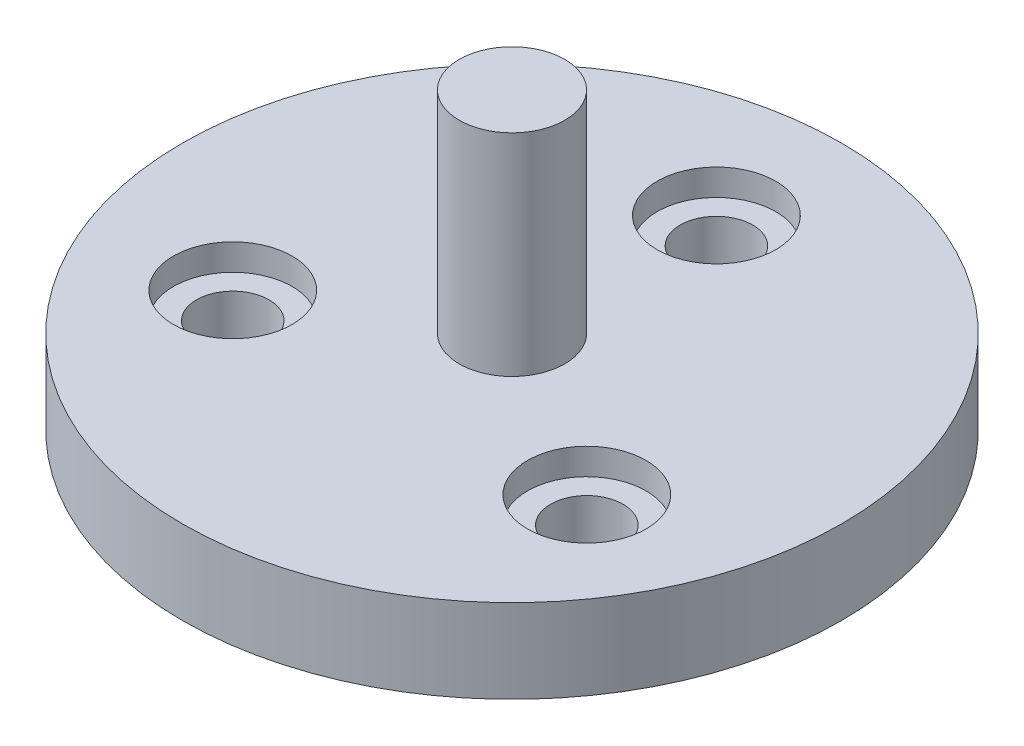
ISO-10303-21;
HEADER;
FILE_DESCRIPTION(('STEP AP214'),'2;1');
FILE_NAME('part.step','',(''),(''),'','','');
FILE_SCHEMA(('AUTOMOTIVE_DESIGN { 1 0 10303 214 1 1 1 1 }'));
ENDSEC;
DATA;
#1=APPLICATION_CONTEXT('core data for automotive mechanical design processes');
#2=APPLICATION_PROTOCOL_DEFINITION('international standard','automotive_design',2000,#1);
#3=PRODUCT_CONTEXT('',#1,'mechanical');
#4=PRODUCT('Part','Part','',(#3));
#5=PRODUCT_RELATED_PRODUCT_CATEGORY('part','',(#4));
#6=PRODUCT_DEFINITION_FORMATION('','',#4);
#7=PRODUCT_DEFINITION_CONTEXT('part definition',#1,'design');
#8=PRODUCT_DEFINITION('design','',#6,#7);
#9=PRODUCT_DEFINITION_SHAPE('','',#8);
#10=(LENGTH_UNIT() NAMED_UNIT(*) SI_UNIT(.MILLI.,.METRE.));
#11=(NAMED_UNIT(*) PLANE_ANGLE_UNIT() SI_UNIT($,.RADIAN.));
#12=(NAMED_UNIT(*) SI_UNIT($,.STERADIAN.) SOLID_ANGLE_UNIT());
#13=UNCERTAINTY_MEASURE_WITH_UNIT(LENGTH_MEASURE(1.E-05),#10,'distance_accuracy_value','');
#14=(GEOMETRIC_REPRESENTATION_CONTEXT(3) GLOBAL_UNCERTAINTY_ASSIGNED_CONTEXT((#13)) GLOBAL_UNIT_ASSIGNED_CONTEXT((#10,
#11,#12)) REPRESENTATION_CONTEXT('',''));
#15=CARTESIAN_POINT('',(0.,0.,0.));
#16=DIRECTION('',(0.,0.,1.));
#17=DIRECTION('',(1.,0.,0.));
#18=AXIS2_PLACEMENT_3D('',#15,#16,#17);
#19=CARTESIAN_POINT('',(0.,0.,4.));
#20=DIRECTION('',(0.,-1.,0.));
#21=DIRECTION('',(0.,0.,-1.));
#22=AXIS2_PLACEMENT_3D('',#19,#20,#21);
#23=PLANE('',#22);
#24=CARTESIAN_POINT('',(-13.4233937586588,0.,7.74999999999996));
#25=DIRECTION('',(0.,1.,0.));
#26=DIRECTION('',(0.,0.,1.));
#27=AXIS2_PLACEMENT_3D('',#24,#25,#26);
#28=CIRCLE('',#27,4.5);
#29=CARTESIAN_POINT('',(-13.4233937586588,0.,12.25));
#30=VERTEX_POINT('',#29);
#31=EDGE_CURVE('E72',#30,#30,#28,.T.);
#32=ORIENTED_EDGE('',*,*,#31,.F.);
#33=EDGE_LOOP('',(#32));
#34=FACE_BOUND('',#33,.T.);
#35=CARTESIAN_POINT('',(13.4233937586588,0.,7.75000000000007));
#36=DIRECTION('',(0.,1.,0.));
#37=DIRECTION('',(0.,0.,1.));
#38=AXIS2_PLACEMENT_3D('',#35,#36,#37);
#39=CIRCLE('',#38,4.5);
#40=CARTESIAN_POINT('',(13.4233937586588,0.,12.2500000000001));
#41=VERTEX_POINT('',#40);
#42=EDGE_CURVE('E60',#41,#41,#39,.T.);
#43=ORIENTED_EDGE('',*,*,#42,.F.);
#44=EDGE_LOOP('',(#43));
#45=FACE_BOUND('',#44,.T.);
#46=CARTESIAN_POINT('',(0.,0.,0.));
#47=DIRECTION('',(0.,-1.,0.));
#48=DIRECTION('',(0.,0.,-1.));
#49=AXIS2_PLACEMENT_3D('',#46,#47,#48);
#50=CIRCLE('',#49,25.);
#51=CARTESIAN_POINT('',(0.,0.,-25.));
#52=VERTEX_POINT('',#51);
#53=EDGE_CURVE('E42',#52,#52,#50,.T.);
#54=ORIENTED_EDGE('',*,*,#53,.F.);
#55=EDGE_LOOP('',(#54));
#56=FACE_BOUND('',#55,.T.);
#57=CARTESIAN_POINT('',(0.,0.,0.));
#58=DIRECTION('',(0.,-1.,0.));
#59=DIRECTION('',(0.,0.,-1.));
#60=AXIS2_PLACEMENT_3D('',#57,#58,#59);
#61=CIRCLE('',#60,4.);
#62=CARTESIAN_POINT('',(0.,0.,-4.));
#63=VERTEX_POINT('',#62);
#64=EDGE_CURVE('E38',#63,#63,#61,.T.);
#65=ORIENTED_EDGE('',*,*,#64,.T.);
#66=EDGE_LOOP('',(#65));
#67=FACE_BOUND('',#66,.T.);
#68=CARTESIAN_POINT('',(0.,0.,-15.5));
#69=DIRECTION('',(0.,1.,0.));
#70=DIRECTION('',(0.,0.,1.));
#71=AXIS2_PLACEMENT_3D('',#68,#69,#70);
#72=CIRCLE('',#71,4.5);
#73=CARTESIAN_POINT('',(0.,0.,-11.));
#74=VERTEX_POINT('',#73);
#75=EDGE_CURVE('E84',#74,#74,#72,.T.);
#76=ORIENTED_EDGE('',*,*,#75,.F.);
#77=EDGE_LOOP('',(#76));
#78=FACE_BOUND('',#77,.T.);
#79=ADVANCED_FACE('F31',(#34,#45,#56,#67,#78),#23,.F.);
#80=CARTESIAN_POINT('',(0.,-6.35,25.));
#81=DIRECTION('',(0.,1.,0.));
#82=DIRECTION('',(0.,0.,1.));
#83=AXIS2_PLACEMENT_3D('',#80,#81,#82);
#84=PLANE('',#83);
#85=CARTESIAN_POINT('',(0.,-6.35,-15.5));
#86=DIRECTION('',(0.,1.,0.));
#87=DIRECTION('',(0.,0.,1.));
#88=AXIS2_PLACEMENT_3D('',#85,#86,#87);
#89=CIRCLE('',#88,2.75);
#90=CARTESIAN_POINT('',(0.,-6.35,-12.75));
#91=VERTEX_POINT('',#90);
#92=EDGE_CURVE('E75',#91,#91,#89,.T.);
#93=ORIENTED_EDGE('',*,*,#92,.T.);
#94=EDGE_LOOP('',(#93));
#95=FACE_BOUND('',#94,.T.);
#96=CARTESIAN_POINT('',(-13.4233937586588,-6.35,7.74999999999996));
#97=DIRECTION('',(0.,1.,0.));
#98=DIRECTION('',(0.,0.,1.));
#99=AXIS2_PLACEMENT_3D('',#96,#97,#98);
#100=CIRCLE('',#99,2.75);
#101=CARTESIAN_POINT('',(-13.4233937586588,-6.35,10.5));
#102=VERTEX_POINT('',#101);
#103=EDGE_CURVE('E63',#102,#102,#100,.T.);
#104=ORIENTED_EDGE('',*,*,#103,.T.);
#105=EDGE_LOOP('',(#104));
#106=FACE_BOUND('',#105,.T.);
#107=CARTESIAN_POINT('',(13.4233937586588,-6.35,7.75000000000007));
#108=DIRECTION('',(0.,1.,0.));
#109=DIRECTION('',(0.,0.,1.));
#110=AXIS2_PLACEMENT_3D('',#107,#108,#109);
#111=CIRCLE('',#110,2.75);
#112=CARTESIAN_POINT('',(13.4233937586588,-6.35,10.5000000000001));
#113=VERTEX_POINT('',#112);
#114=EDGE_CURVE('E51',#113,#113,#111,.T.);
#115=ORIENTED_EDGE('',*,*,#114,.T.);
#116=EDGE_LOOP('',(#115));
#117=FACE_BOUND('',#116,.T.);
#118=CARTESIAN_POINT('',(0.,-6.35000000000001,0.));
#119=DIRECTION('',(0.,-1.,0.));
#120=DIRECTION('',(0.,0.,-1.));
#121=AXIS2_PLACEMENT_3D('',#118,#119,#120);
#122=CIRCLE('',#121,25.);
#123=CARTESIAN_POINT('',(0.,-6.35000000000001,-25.));
#124=VERTEX_POINT('',#123);
#125=EDGE_CURVE('E46',#124,#124,#122,.T.);
#126=ORIENTED_EDGE('',*,*,#125,.T.);
#127=EDGE_LOOP('',(#126));
#128=FACE_BOUND('',#127,.T.);
#129=ADVANCED_FACE('F33',(#95,#106,#117,#128),#84,.F.);
#130=CARTESIAN_POINT('',(0.,16.,0.));
#131=DIRECTION('',(0.,-1.,0.));
#132=DIRECTION('',(0.,0.,-1.));
#133=AXIS2_PLACEMENT_3D('',#130,#131,#132);
#134=PLANE('',#133);
#135=CARTESIAN_POINT('',(0.,16.,0.));
#136=DIRECTION('',(0.,-1.,0.));
#137=DIRECTION('',(0.,0.,-1.));
#138=AXIS2_PLACEMENT_3D('',#135,#136,#137);
#139=CIRCLE('',#138,4.);
#140=CARTESIAN_POINT('',(0.,16.,-4.));
#141=VERTEX_POINT('',#140);
#142=EDGE_CURVE('E10',#141,#141,#139,.T.);
#143=ORIENTED_EDGE('',*,*,#142,.F.);
#144=EDGE_LOOP('',(#143));
#145=FACE_BOUND('',#144,.T.);
#146=ADVANCED_FACE('F96',(#145),#134,.F.);
#147=CARTESIAN_POINT('',(0.,-6.35,0.));
#148=DIRECTION('',(0.,-1.,0.));
#149=DIRECTION('',(0.,0.,-1.));
#150=AXIS2_PLACEMENT_3D('',#147,#148,#149);
#151=CYLINDRICAL_SURFACE('',#150,4.);
#152=ORIENTED_EDGE('',*,*,#64,.F.);
#153=EDGE_LOOP('',(#152));
#154=FACE_BOUND('',#153,.T.);
#155=ORIENTED_EDGE('',*,*,#142,.T.);
#156=EDGE_LOOP('',(#155));
#157=FACE_BOUND('',#156,.T.);
#158=ADVANCED_FACE('F104',(#154,#157),#151,.T.);
#159=CARTESIAN_POINT('',(0.,-6.35,0.));
#160=DIRECTION('',(0.,-1.,0.));
#161=DIRECTION('',(0.,0.,-1.));
#162=AXIS2_PLACEMENT_3D('',#159,#160,#161);
#163=CYLINDRICAL_SURFACE('',#162,25.);
#164=ORIENTED_EDGE('',*,*,#125,.F.);
#165=EDGE_LOOP('',(#164));
#166=FACE_BOUND('',#165,.T.);
#167=ORIENTED_EDGE('',*,*,#53,.T.);
#168=EDGE_LOOP('',(#167));
#169=FACE_BOUND('',#168,.T.);
#170=ADVANCED_FACE('F102',(#166,#169),#163,.T.);
#171=CARTESIAN_POINT('',(13.4233937586588,0.,7.75000000000007));
#172=DIRECTION('',(0.,1.,0.));
#173=DIRECTION('',(0.,0.,1.));
#174=AXIS2_PLACEMENT_3D('',#171,#172,#173);
#175=CYLINDRICAL_SURFACE('',#174,2.75);
#176=ORIENTED_EDGE('',*,*,#114,.F.);
#177=EDGE_LOOP('',(#176));
#178=FACE_BOUND('',#177,.T.);
#179=CARTESIAN_POINT('',(13.4233937586588,-2.,7.75000000000007));
#180=DIRECTION('',(0.,1.,0.));
#181=DIRECTION('',(0.,0.,1.));
#182=AXIS2_PLACEMENT_3D('',#179,#180,#181);
#183=CIRCLE('',#182,2.75);
#184=CARTESIAN_POINT('',(13.4233937586588,-2.,10.5000000000001));
#185=VERTEX_POINT('',#184);
#186=EDGE_CURVE('E54',#185,#185,#183,.T.);
#187=ORIENTED_EDGE('',*,*,#186,.T.);
#188=EDGE_LOOP('',(#187));
#189=FACE_BOUND('',#188,.T.);
#190=ADVANCED_FACE('F123',(#178,#189),#175,.F.);
#191=CARTESIAN_POINT('',(16.1733937586588,-2.,7.75000000000007));
#192=DIRECTION('',(0.,-1.,0.));
#193=DIRECTION('',(0.,0.,-1.));
#194=AXIS2_PLACEMENT_3D('',#191,#192,#193);
#195=PLANE('',#194);
#196=ORIENTED_EDGE('',*,*,#186,.F.);
#197=EDGE_LOOP('',(#196));
#198=FACE_BOUND('',#197,.T.);
#199=CARTESIAN_POINT('',(13.4233937586588,-2.,7.75000000000007));
#200=DIRECTION('',(0.,1.,0.));
#201=DIRECTION('',(0.,0.,1.));
#202=AXIS2_PLACEMENT_3D('',#199,#200,#201);
#203=CIRCLE('',#202,4.5);
#204=CARTESIAN_POINT('',(13.4233937586588,-2.,12.2500000000001));
#205=VERTEX_POINT('',#204);
#206=EDGE_CURVE('E57',#205,#205,#203,.T.);
#207=ORIENTED_EDGE('',*,*,#206,.T.);
#208=EDGE_LOOP('',(#207));
#209=FACE_BOUND('',#208,.T.);
#210=ADVANCED_FACE('F130',(#198,#209),#195,.F.);
#211=CARTESIAN_POINT('',(13.4233937586588,0.,7.75000000000007));
#212=DIRECTION('',(0.,1.,0.));
#213=DIRECTION('',(0.,0.,1.));
#214=AXIS2_PLACEMENT_3D('',#211,#212,#213);
#215=CYLINDRICAL_SURFACE('',#214,4.5);
#216=ORIENTED_EDGE('',*,*,#206,.F.);
#217=EDGE_LOOP('',(#216));
#218=FACE_BOUND('',#217,.T.);
#219=ORIENTED_EDGE('',*,*,#42,.T.);
#220=EDGE_LOOP('',(#219));
#221=FACE_BOUND('',#220,.T.);
#222=ADVANCED_FACE('F137',(#218,#221),#215,.F.);
#223=CARTESIAN_POINT('',(-13.4233937586588,0.,7.74999999999996));
#224=DIRECTION('',(0.,1.,0.));
#225=DIRECTION('',(0.,0.,1.));
#226=AXIS2_PLACEMENT_3D('',#223,#224,#225);
#227=CYLINDRICAL_SURFACE('',#226,2.75);
#228=ORIENTED_EDGE('',*,*,#103,.F.);
#229=EDGE_LOOP('',(#228));
#230=FACE_BOUND('',#229,.T.);
#231=CARTESIAN_POINT('',(-13.4233937586588,-2.,7.74999999999996));
#232=DIRECTION('',(0.,1.,0.));
#233=DIRECTION('',(0.,0.,1.));
#234=AXIS2_PLACEMENT_3D('',#231,#232,#233);
#235=CIRCLE('',#234,2.75);
#236=CARTESIAN_POINT('',(-13.4233937586588,-2.,10.5));
#237=VERTEX_POINT('',#236);
#238=EDGE_CURVE('E66',#237,#237,#235,.T.);
#239=ORIENTED_EDGE('',*,*,#238,.T.);
#240=EDGE_LOOP('',(#239));
#241=FACE_BOUND('',#240,.T.);
#242=ADVANCED_FACE('F145',(#230,#241),#227,.F.);
#243=CARTESIAN_POINT('',(-10.6733937586588,-2.,7.74999999999996));
#244=DIRECTION('',(0.,-1.,0.));
#245=DIRECTION('',(0.,0.,-1.));
#246=AXIS2_PLACEMENT_3D('',#243,#244,#245);
#247=PLANE('',#246);
#248=ORIENTED_EDGE('',*,*,#238,.F.);
#249=EDGE_LOOP('',(#248));
#250=FACE_BOUND('',#249,.T.);
#251=CARTESIAN_POINT('',(-13.4233937586588,-2.,7.74999999999996));
#252=DIRECTION('',(0.,1.,0.));
#253=DIRECTION('',(0.,0.,1.));
#254=AXIS2_PLACEMENT_3D('',#251,#252,#253);
#255=CIRCLE('',#254,4.5);
#256=CARTESIAN_POINT('',(-13.4233937586588,-2.,12.25));
#257=VERTEX_POINT('',#256);
#258=EDGE_CURVE('E69',#257,#257,#255,.T.);
#259=ORIENTED_EDGE('',*,*,#258,.T.);
#260=EDGE_LOOP('',(#259));
#261=FACE_BOUND('',#260,.T.);
#262=ADVANCED_FACE('F153',(#250,#261),#247,.F.);
#263=CARTESIAN_POINT('',(-13.4233937586588,0.,7.74999999999996));
#264=DIRECTION('',(0.,1.,0.));
#265=DIRECTION('',(0.,0.,1.));
#266=AXIS2_PLACEMENT_3D('',#263,#264,#265);
#267=CYLINDRICAL_SURFACE('',#266,4.5);
#268=ORIENTED_EDGE('',*,*,#258,.F.);
#269=EDGE_LOOP('',(#268));
#270=FACE_BOUND('',#269,.T.);
#271=ORIENTED_EDGE('',*,*,#31,.T.);
#272=EDGE_LOOP('',(#271));
#273=FACE_BOUND('',#272,.T.);
#274=ADVANCED_FACE('F161',(#270,#273),#267,.F.);
#275=CARTESIAN_POINT('',(0.,0.,-15.5));
#276=DIRECTION('',(0.,1.,0.));
#277=DIRECTION('',(0.,0.,1.));
#278=AXIS2_PLACEMENT_3D('',#275,#276,#277);
#279=CYLINDRICAL_SURFACE('',#278,2.75);
#280=ORIENTED_EDGE('',*,*,#92,.F.);
#281=EDGE_LOOP('',(#280));
#282=FACE_BOUND('',#281,.T.);
#283=CARTESIAN_POINT('',(0.,-2.,-15.5));
#284=DIRECTION('',(0.,1.,0.));
#285=DIRECTION('',(0.,0.,1.));
#286=AXIS2_PLACEMENT_3D('',#283,#284,#285);
#287=CIRCLE('',#286,2.75);
#288=CARTESIAN_POINT('',(0.,-2.,-12.75));
#289=VERTEX_POINT('',#288);
#290=EDGE_CURVE('E78',#289,#289,#287,.T.);
#291=ORIENTED_EDGE('',*,*,#290,.T.);
#292=EDGE_LOOP('',(#291));
#293=FACE_BOUND('',#292,.T.);
#294=ADVANCED_FACE('F169',(#282,#293),#279,.F.);
#295=CARTESIAN_POINT('',(2.75,-2.,-15.5));
#296=DIRECTION('',(0.,-1.,0.));
#297=DIRECTION('',(0.,0.,-1.));
#298=AXIS2_PLACEMENT_3D('',#295,#296,#297);
#299=PLANE('',#298);
#300=ORIENTED_EDGE('',*,*,#290,.F.);
#301=EDGE_LOOP('',(#300));
#302=FACE_BOUND('',#301,.T.);
#303=CARTESIAN_POINT('',(0.,-2.,-15.5));
#304=DIRECTION('',(0.,1.,0.));
#305=DIRECTION('',(0.,0.,1.));
#306=AXIS2_PLACEMENT_3D('',#303,#304,#305);
#307=CIRCLE('',#306,4.5);
#308=CARTESIAN_POINT('',(0.,-2.,-11.));
#309=VERTEX_POINT('',#308);
#310=EDGE_CURVE('E81',#309,#309,#307,.T.);
#311=ORIENTED_EDGE('',*,*,#310,.T.);
#312=EDGE_LOOP('',(#311));
#313=FACE_BOUND('',#312,.T.);
#314=ADVANCED_FACE('F177',(#302,#313),#299,.F.);
#315=CARTESIAN_POINT('',(0.,0.,-15.5));
#316=DIRECTION('',(0.,1.,0.));
#317=DIRECTION('',(0.,0.,1.));
#318=AXIS2_PLACEMENT_3D('',#315,#316,#317);
#319=CYLINDRICAL_SURFACE('',#318,4.5);
#320=ORIENTED_EDGE('',*,*,#310,.F.);
#321=EDGE_LOOP('',(#320));
#322=FACE_BOUND('',#321,.T.);
#323=ORIENTED_EDGE('',*,*,#75,.T.);
#324=EDGE_LOOP('',(#323));
#325=FACE_BOUND('',#324,.T.);
#326=ADVANCED_FACE('F88',(#322,#325),#319,.F.);
#327=CLOSED_SHELL('',(#79,#129,#146,#158,#170,#190,#210,#222,#242,#262,#274,#294,#314,#326));
#328=MANIFOLD_SOLID_BREP('B2',#327);
#329=ADVANCED_BREP_SHAPE_REPRESENTATION('',(#18,#328),#14);
#330=SHAPE_DEFINITION_REPRESENTATION(#9,#329);
ENDSEC;
END-ISO-10303-21;
